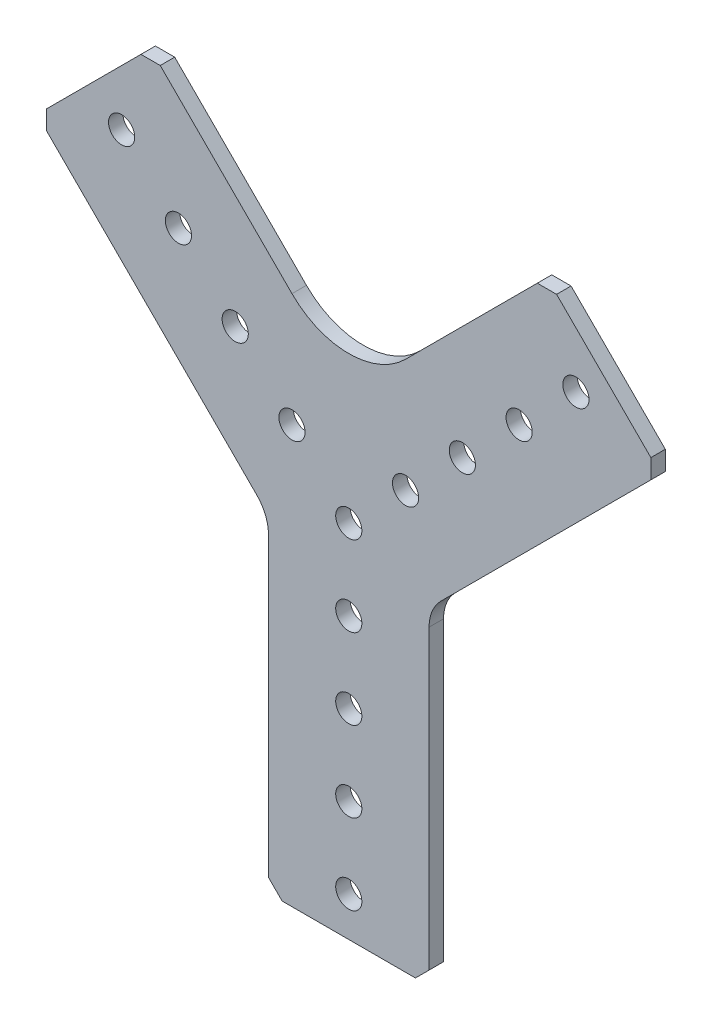
ISO-10303-21;
HEADER;
FILE_DESCRIPTION(('STEP AP214'),'2;1');
FILE_NAME('part.step','',(''),(''),'','','');
FILE_SCHEMA(('AUTOMOTIVE_DESIGN { 1 0 10303 214 1 1 1 1 }'));
ENDSEC;
DATA;
#1=APPLICATION_CONTEXT('core data for automotive mechanical design processes');
#2=APPLICATION_PROTOCOL_DEFINITION('international standard','automotive_design',2000,#1);
#3=PRODUCT_CONTEXT('',#1,'mechanical');
#4=PRODUCT('Part','Part','',(#3));
#5=PRODUCT_RELATED_PRODUCT_CATEGORY('part','',(#4));
#6=PRODUCT_DEFINITION_FORMATION('','',#4);
#7=PRODUCT_DEFINITION_CONTEXT('part definition',#1,'design');
#8=PRODUCT_DEFINITION('design','',#6,#7);
#9=PRODUCT_DEFINITION_SHAPE('','',#8);
#10=(LENGTH_UNIT() NAMED_UNIT(*) SI_UNIT(.MILLI.,.METRE.));
#11=(NAMED_UNIT(*) PLANE_ANGLE_UNIT() SI_UNIT($,.RADIAN.));
#12=(NAMED_UNIT(*) SI_UNIT($,.STERADIAN.) SOLID_ANGLE_UNIT());
#13=UNCERTAINTY_MEASURE_WITH_UNIT(LENGTH_MEASURE(1.E-05),#10,'distance_accuracy_value','');
#14=(GEOMETRIC_REPRESENTATION_CONTEXT(3) GLOBAL_UNCERTAINTY_ASSIGNED_CONTEXT((#13)) GLOBAL_UNIT_ASSIGNED_CONTEXT((#10,
#11,#12)) REPRESENTATION_CONTEXT('',''));
#15=CARTESIAN_POINT('',(0.,0.,0.));
#16=DIRECTION('',(0.,0.,1.));
#17=DIRECTION('',(1.,0.,0.));
#18=AXIS2_PLACEMENT_3D('',#15,#16,#17);
#19=CARTESIAN_POINT('',(31.3410938625313,49.3016061046697,2.286));
#20=DIRECTION('',(0.707106781186548,-0.707106781186547,0.));
#21=DIRECTION('',(0.707106781186547,0.707106781186548,0.));
#22=AXIS2_PLACEMENT_3D('',#19,#20,#21);
#23=PLANE('',#22);
#24=DIRECTION('',(-0.707106781186547,-0.707106781186548,0.));
#25=VECTOR('',#24,1.);
#26=CARTESIAN_POINT('',(29.8144503219496,47.7749625640879,0.));
#27=LINE('',#26,#25);
#28=CARTESIAN_POINT('',(29.8144503219496,47.7749625640879,0.));
#29=VERTEX_POINT('',#28);
#30=CARTESIAN_POINT('',(8.98025612106916,26.9407683632075,0.));
#31=VERTEX_POINT('',#30);
#32=EDGE_CURVE('E338',#29,#31,#27,.T.);
#33=ORIENTED_EDGE('',*,*,#32,.T.);
#34=DIRECTION('',(0.,0.,-1.));
#35=VECTOR('',#34,1.);
#36=CARTESIAN_POINT('',(8.98025612106915,26.9407683632075,2.286));
#37=LINE('',#36,#35);
#38=CARTESIAN_POINT('',(8.98025612106915,26.9407683632075,2.286));
#39=VERTEX_POINT('',#38);
#40=EDGE_CURVE('E82',#31,#39,#37,.F.);
#41=ORIENTED_EDGE('',*,*,#40,.T.);
#42=DIRECTION('',(0.707106781186547,0.707106781186548,0.));
#43=VECTOR('',#42,1.);
#44=CARTESIAN_POINT('',(31.3410938625313,49.3016061046697,2.286));
#45=LINE('',#44,#43);
#46=CARTESIAN_POINT('',(29.8144503219496,47.7749625640879,2.286));
#47=VERTEX_POINT('',#46);
#48=EDGE_CURVE('E380',#47,#39,#45,.F.);
#49=ORIENTED_EDGE('',*,*,#48,.F.);
#50=DIRECTION('',(0.,0.,1.));
#51=VECTOR('',#50,1.);
#52=CARTESIAN_POINT('',(29.8144503219496,47.7749625640879,2.286));
#53=LINE('',#52,#51);
#54=EDGE_CURVE('E383',#29,#47,#53,.T.);
#55=ORIENTED_EDGE('',*,*,#54,.F.);
#56=EDGE_LOOP('',(#33,#41,#49,#55));
#57=FACE_BOUND('',#56,.T.);
#58=ADVANCED_FACE('F54',(#57),#23,.F.);
#59=CARTESIAN_POINT('',(-12.7,-57.023,2.286));
#60=DIRECTION('',(1.,0.,0.));
#61=DIRECTION('',(0.,1.,0.));
#62=AXIS2_PLACEMENT_3D('',#59,#60,#61);
#63=PLANE('',#62);
#64=DIRECTION('',(0.,0.,1.));
#65=VECTOR('',#64,1.);
#66=CARTESIAN_POINT('',(-12.7,-7.89076836320745,2.286));
#67=LINE('',#66,#65);
#68=CARTESIAN_POINT('',(-12.7,-7.89076836320745,0.));
#69=VERTEX_POINT('',#68);
#70=CARTESIAN_POINT('',(-12.7,-7.89076836320746,2.286));
#71=VERTEX_POINT('',#70);
#72=EDGE_CURVE('E279',#69,#71,#67,.T.);
#73=ORIENTED_EDGE('',*,*,#72,.F.);
#74=DIRECTION('',(0.,1.,0.));
#75=VECTOR('',#74,1.);
#76=CARTESIAN_POINT('',(-12.7,0.,0.));
#77=LINE('',#76,#75);
#78=CARTESIAN_POINT('',(-12.7,-54.864,0.));
#79=VERTEX_POINT('',#78);
#80=EDGE_CURVE('E335',#69,#79,#77,.F.);
#81=ORIENTED_EDGE('',*,*,#80,.T.);
#82=DIRECTION('',(0.,0.,1.));
#83=VECTOR('',#82,1.);
#84=CARTESIAN_POINT('',(-12.7,-54.864,2.286));
#85=LINE('',#84,#83);
#86=CARTESIAN_POINT('',(-12.7,-54.864,2.286));
#87=VERTEX_POINT('',#86);
#88=EDGE_CURVE('E373',#79,#87,#85,.T.);
#89=ORIENTED_EDGE('',*,*,#88,.T.);
#90=DIRECTION('',(0.,1.,0.));
#91=VECTOR('',#90,1.);
#92=CARTESIAN_POINT('',(-12.7,-57.023,2.286));
#93=LINE('',#92,#91);
#94=EDGE_CURVE('E377',#71,#87,#93,.F.);
#95=ORIENTED_EDGE('',*,*,#94,.F.);
#96=EDGE_LOOP('',(#73,#81,#89,#95));
#97=FACE_BOUND('',#96,.T.);
#98=ADVANCED_FACE('F584',(#97),#63,.F.);
#99=CARTESIAN_POINT('',(8.98025612106925,8.98025612106906,2.286));
#100=DIRECTION('',(0.,0.,-1.));
#101=DIRECTION('',(-1.,0.,0.));
#102=AXIS2_PLACEMENT_3D('',#99,#100,#101);
#103=CYLINDRICAL_SURFACE('',#102,2.0701);
#104=CARTESIAN_POINT('',(8.98025612106925,8.98025612106906,2.286));
#105=DIRECTION('',(0.,0.,-1.));
#106=DIRECTION('',(-1.,0.,0.));
#107=AXIS2_PLACEMENT_3D('',#104,#105,#106);
#108=CIRCLE('',#107,2.0701);
#109=CARTESIAN_POINT('',(6.91015612106925,8.98025612106906,2.286));
#110=VERTEX_POINT('',#109);
#111=EDGE_CURVE('E516',#110,#110,#108,.T.);
#112=ORIENTED_EDGE('',*,*,#111,.F.);
#113=EDGE_LOOP('',(#112));
#114=FACE_BOUND('',#113,.T.);
#115=CARTESIAN_POINT('',(8.98025612106925,8.98025612106906,0.));
#116=DIRECTION('',(0.,0.,-1.));
#117=DIRECTION('',(-1.,0.,0.));
#118=AXIS2_PLACEMENT_3D('',#115,#116,#117);
#119=CIRCLE('',#118,2.0701);
#120=CARTESIAN_POINT('',(6.91015612106925,8.98025612106906,0.));
#121=VERTEX_POINT('',#120);
#122=EDGE_CURVE('E479',#121,#121,#119,.T.);
#123=ORIENTED_EDGE('',*,*,#122,.T.);
#124=EDGE_LOOP('',(#123));
#125=FACE_BOUND('',#124,.T.);
#126=ADVANCED_FACE('F589',(#114,#125),#103,.F.);
#127=CARTESIAN_POINT('',(0.,0.,2.286));
#128=DIRECTION('',(0.,0.,1.));
#129=DIRECTION('',(1.,0.,0.));
#130=AXIS2_PLACEMENT_3D('',#127,#128,#129);
#131=PLANE('',#130);
#132=ORIENTED_EDGE('',*,*,#111,.T.);
#133=EDGE_LOOP('',(#132));
#134=FACE_BOUND('',#133,.T.);
#135=CARTESIAN_POINT('',(-8.98025612106925,8.98025612106906,2.286));
#136=DIRECTION('',(0.,0.,1.));
#137=DIRECTION('',(1.,0.,0.));
#138=AXIS2_PLACEMENT_3D('',#135,#136,#137);
#139=CIRCLE('',#138,2.0701);
#140=CARTESIAN_POINT('',(-6.91015612106925,8.98025612106906,2.286));
#141=VERTEX_POINT('',#140);
#142=EDGE_CURVE('E320',#141,#141,#139,.T.);
#143=ORIENTED_EDGE('',*,*,#142,.F.);
#144=EDGE_LOOP('',(#143));
#145=FACE_BOUND('',#144,.T.);
#146=ORIENTED_EDGE('',*,*,#48,.T.);
#147=CARTESIAN_POINT('',(0.,35.9210244842766,2.286));
#148=DIRECTION('',(0.,0.,1.));
#149=DIRECTION('',(1.,0.,0.));
#150=AXIS2_PLACEMENT_3D('',#147,#148,#149);
#151=CIRCLE('',#150,12.7);
#152=CARTESIAN_POINT('',(-8.98025612106915,26.9407683632075,2.286));
#153=VERTEX_POINT('',#152);
#154=EDGE_CURVE('E13',#39,#153,#151,.F.);
#155=ORIENTED_EDGE('',*,*,#154,.T.);
#156=DIRECTION('',(-0.707106781186547,0.707106781186548,0.));
#157=VECTOR('',#156,1.);
#158=CARTESIAN_POINT('',(-31.3410938625313,49.3016061046697,2.286));
#159=LINE('',#158,#157);
#160=CARTESIAN_POINT('',(-29.8144503219496,47.7749625640879,2.286));
#161=VERTEX_POINT('',#160);
#162=EDGE_CURVE('E242',#161,#153,#159,.F.);
#163=ORIENTED_EDGE('',*,*,#162,.F.);
#164=DIRECTION('',(-1.,0.,0.));
#165=VECTOR('',#164,1.);
#166=CARTESIAN_POINT('',(-29.8144503219496,47.7749625640879,2.286));
#167=LINE('',#166,#165);
#168=CARTESIAN_POINT('',(-32.8677374031131,47.7749625640879,2.286));
#169=VERTEX_POINT('',#168);
#170=EDGE_CURVE('E240',#169,#161,#167,.F.);
#171=ORIENTED_EDGE('',*,*,#170,.F.);
#172=DIRECTION('',(-0.707106781186548,-0.707106781186547,0.));
#173=VECTOR('',#172,1.);
#174=CARTESIAN_POINT('',(-49.3016061046696,31.3410938625314,2.286));
#175=LINE('',#174,#173);
#176=CARTESIAN_POINT('',(-47.7749625640879,32.8677374031131,2.286));
#177=VERTEX_POINT('',#176);
#178=EDGE_CURVE('E256',#177,#169,#175,.F.);
#179=ORIENTED_EDGE('',*,*,#178,.F.);
#180=DIRECTION('',(0.,-1.,0.));
#181=VECTOR('',#180,1.);
#182=CARTESIAN_POINT('',(-47.7749625640879,32.8677374031131,2.286));
#183=LINE('',#182,#181);
#184=CARTESIAN_POINT('',(-47.7749625640879,29.8144503219496,2.286));
#185=VERTEX_POINT('',#184);
#186=EDGE_CURVE('E263',#185,#177,#183,.F.);
#187=ORIENTED_EDGE('',*,*,#186,.F.);
#188=DIRECTION('',(0.707106781186547,-0.707106781186548,0.));
#189=VECTOR('',#188,1.);
#190=CARTESIAN_POINT('',(-12.7,-5.26051224213831,2.286));
#191=LINE('',#190,#189);
#192=CARTESIAN_POINT('',(-14.5598719394654,-3.40064030267288,2.286));
#193=VERTEX_POINT('',#192);
#194=EDGE_CURVE('E266',#193,#185,#191,.F.);
#195=ORIENTED_EDGE('',*,*,#194,.F.);
#196=CARTESIAN_POINT('',(-19.05,-7.89076836320745,2.286));
#197=DIRECTION('',(0.,0.,-1.));
#198=DIRECTION('',(-1.,0.,0.));
#199=AXIS2_PLACEMENT_3D('',#196,#197,#198);
#200=CIRCLE('',#199,6.35);
#201=EDGE_CURVE('E267',#71,#193,#200,.F.);
#202=ORIENTED_EDGE('',*,*,#201,.F.);
#203=ORIENTED_EDGE('',*,*,#94,.T.);
#204=DIRECTION('',(-0.707106781186548,0.707106781186548,0.));
#205=VECTOR('',#204,1.);
#206=CARTESIAN_POINT('',(-10.541,-57.023,2.286));
#207=LINE('',#206,#205);
#208=CARTESIAN_POINT('',(-10.541,-57.023,2.286));
#209=VERTEX_POINT('',#208);
#210=EDGE_CURVE('E370',#87,#209,#207,.F.);
#211=ORIENTED_EDGE('',*,*,#210,.T.);
#212=DIRECTION('',(1.,0.,0.));
#213=VECTOR('',#212,1.);
#214=CARTESIAN_POINT('',(12.7,-57.023,2.286));
#215=LINE('',#214,#213);
#216=CARTESIAN_POINT('',(10.541,-57.023,2.286));
#217=VERTEX_POINT('',#216);
#218=EDGE_CURVE('E368',#209,#217,#215,.T.);
#219=ORIENTED_EDGE('',*,*,#218,.T.);
#220=DIRECTION('',(-0.707106781186547,-0.707106781186548,0.));
#221=VECTOR('',#220,1.);
#222=CARTESIAN_POINT('',(12.7,-54.864,2.286));
#223=LINE('',#222,#221);
#224=CARTESIAN_POINT('',(12.7,-54.864,2.286));
#225=VERTEX_POINT('',#224);
#226=EDGE_CURVE('E428',#217,#225,#223,.F.);
#227=ORIENTED_EDGE('',*,*,#226,.T.);
#228=DIRECTION('',(0.,-1.,0.));
#229=VECTOR('',#228,1.);
#230=CARTESIAN_POINT('',(12.7,-5.2605122421383,2.286));
#231=LINE('',#230,#229);
#232=CARTESIAN_POINT('',(12.7,-7.89076836320745,2.286));
#233=VERTEX_POINT('',#232);
#234=EDGE_CURVE('E423',#225,#233,#231,.F.);
#235=ORIENTED_EDGE('',*,*,#234,.T.);
#236=CARTESIAN_POINT('',(19.05,-7.89076836320745,2.286));
#237=DIRECTION('',(0.,0.,1.));
#238=DIRECTION('',(1.,0.,0.));
#239=AXIS2_PLACEMENT_3D('',#236,#237,#238);
#240=CIRCLE('',#239,6.35);
#241=CARTESIAN_POINT('',(14.5598719394654,-3.40064030267288,2.286));
#242=VERTEX_POINT('',#241);
#243=EDGE_CURVE('E407',#233,#242,#240,.F.);
#244=ORIENTED_EDGE('',*,*,#243,.T.);
#245=DIRECTION('',(-0.707106781186547,-0.707106781186548,0.));
#246=VECTOR('',#245,1.);
#247=CARTESIAN_POINT('',(12.7,-5.26051224213831,2.286));
#248=LINE('',#247,#246);
#249=CARTESIAN_POINT('',(47.7749625640879,29.8144503219496,2.286));
#250=VERTEX_POINT('',#249);
#251=EDGE_CURVE('E406',#242,#250,#248,.F.);
#252=ORIENTED_EDGE('',*,*,#251,.T.);
#253=DIRECTION('',(0.,-1.,0.));
#254=VECTOR('',#253,1.);
#255=CARTESIAN_POINT('',(47.7749625640879,32.8677374031131,2.286));
#256=LINE('',#255,#254);
#257=CARTESIAN_POINT('',(47.7749625640879,32.8677374031131,2.286));
#258=VERTEX_POINT('',#257);
#259=EDGE_CURVE('E401',#250,#258,#256,.F.);
#260=ORIENTED_EDGE('',*,*,#259,.T.);
#261=DIRECTION('',(0.707106781186548,-0.707106781186547,0.));
#262=VECTOR('',#261,1.);
#263=CARTESIAN_POINT('',(49.3016061046696,31.3410938625314,2.286));
#264=LINE('',#263,#262);
#265=CARTESIAN_POINT('',(32.8677374031131,47.7749625640879,2.286));
#266=VERTEX_POINT('',#265);
#267=EDGE_CURVE('E394',#258,#266,#264,.F.);
#268=ORIENTED_EDGE('',*,*,#267,.T.);
#269=DIRECTION('',(1.,0.,0.));
#270=VECTOR('',#269,1.);
#271=CARTESIAN_POINT('',(29.8144503219496,47.7749625640879,2.286));
#272=LINE('',#271,#270);
#273=EDGE_CURVE('E387',#266,#47,#272,.F.);
#274=ORIENTED_EDGE('',*,*,#273,.T.);
#275=EDGE_LOOP('',(#146,#155,#163,#171,#179,#187,#195,#202,#203,#211,#219,#227,#235,#244,#252,
#260,#268,#274));
#276=FACE_BOUND('',#275,.T.);
#277=CARTESIAN_POINT('',(0.,-50.8,2.286));
#278=DIRECTION('',(0.,0.,-1.));
#279=DIRECTION('',(-1.,0.,0.));
#280=AXIS2_PLACEMENT_3D('',#277,#278,#279);
#281=CIRCLE('',#280,2.0701);
#282=CARTESIAN_POINT('',(-2.07009999999999,-50.8,2.286));
#283=VERTEX_POINT('',#282);
#284=EDGE_CURVE('E524',#283,#283,#281,.T.);
#285=ORIENTED_EDGE('',*,*,#284,.T.);
#286=EDGE_LOOP('',(#285));
#287=FACE_BOUND('',#286,.T.);
#288=CARTESIAN_POINT('',(2.66050878019847E-13,-25.4,2.286));
#289=DIRECTION('',(0.,0.,-1.));
#290=DIRECTION('',(-1.,0.,0.));
#291=AXIS2_PLACEMENT_3D('',#288,#289,#290);
#292=CIRCLE('',#291,2.0701);
#293=CARTESIAN_POINT('',(-2.07009999999973,-25.4,2.286));
#294=VERTEX_POINT('',#293);
#295=EDGE_CURVE('E456',#294,#294,#292,.T.);
#296=ORIENTED_EDGE('',*,*,#295,.T.);
#297=EDGE_LOOP('',(#296));
#298=FACE_BOUND('',#297,.T.);
#299=CARTESIAN_POINT('',(1.33025439009923E-13,-12.7,2.286));
#300=DIRECTION('',(0.,0.,-1.));
#301=DIRECTION('',(-1.,0.,0.));
#302=AXIS2_PLACEMENT_3D('',#299,#300,#301);
#303=CIRCLE('',#302,2.0701);
#304=CARTESIAN_POINT('',(-2.07009999999987,-12.7,2.286));
#305=VERTEX_POINT('',#304);
#306=EDGE_CURVE('E450',#305,#305,#303,.T.);
#307=ORIENTED_EDGE('',*,*,#306,.T.);
#308=EDGE_LOOP('',(#307));
#309=FACE_BOUND('',#308,.T.);
#310=CARTESIAN_POINT('',(3.9907631702977E-13,-38.1,2.286));
#311=DIRECTION('',(0.,0.,-1.));
#312=DIRECTION('',(-1.,0.,0.));
#313=AXIS2_PLACEMENT_3D('',#310,#311,#312);
#314=CIRCLE('',#313,2.0701);
#315=CARTESIAN_POINT('',(-2.0700999999996,-38.1,2.286));
#316=VERTEX_POINT('',#315);
#317=EDGE_CURVE('E536',#316,#316,#314,.T.);
#318=ORIENTED_EDGE('',*,*,#317,.T.);
#319=EDGE_LOOP('',(#318));
#320=FACE_BOUND('',#319,.T.);
#321=CARTESIAN_POINT('',(0.,0.,2.286));
#322=DIRECTION('',(0.,0.,-1.));
#323=DIRECTION('',(-1.,0.,0.));
#324=AXIS2_PLACEMENT_3D('',#321,#322,#323);
#325=CIRCLE('',#324,2.0701);
#326=CARTESIAN_POINT('',(-2.0701,0.,2.286));
#327=VERTEX_POINT('',#326);
#328=EDGE_CURVE('E297',#327,#327,#325,.T.);
#329=ORIENTED_EDGE('',*,*,#328,.T.);
#330=EDGE_LOOP('',(#329));
#331=FACE_BOUND('',#330,.T.);
#332=CARTESIAN_POINT('',(-26.9407683632077,26.9407683632072,2.286));
#333=DIRECTION('',(0.,0.,1.));
#334=DIRECTION('',(1.,0.,0.));
#335=AXIS2_PLACEMENT_3D('',#332,#333,#334);
#336=CIRCLE('',#335,2.0701);
#337=CARTESIAN_POINT('',(-24.8706683632077,26.9407683632072,2.286));
#338=VERTEX_POINT('',#337);
#339=EDGE_CURVE('E247',#338,#338,#336,.T.);
#340=ORIENTED_EDGE('',*,*,#339,.F.);
#341=EDGE_LOOP('',(#340));
#342=FACE_BOUND('',#341,.T.);
#343=CARTESIAN_POINT('',(-17.9605122421385,17.9605122421381,2.286));
#344=DIRECTION('',(0.,0.,1.));
#345=DIRECTION('',(1.,0.,0.));
#346=AXIS2_PLACEMENT_3D('',#343,#344,#345);
#347=CIRCLE('',#346,2.0701);
#348=CARTESIAN_POINT('',(-15.8904122421385,17.9605122421381,2.286));
#349=VERTEX_POINT('',#348);
#350=EDGE_CURVE('E316',#349,#349,#347,.T.);
#351=ORIENTED_EDGE('',*,*,#350,.F.);
#352=EDGE_LOOP('',(#351));
#353=FACE_BOUND('',#352,.T.);
#354=CARTESIAN_POINT('',(-35.9210244842766,35.9210244842766,2.286));
#355=DIRECTION('',(0.,0.,1.));
#356=DIRECTION('',(1.,0.,0.));
#357=AXIS2_PLACEMENT_3D('',#354,#355,#356);
#358=CIRCLE('',#357,2.0701);
#359=CARTESIAN_POINT('',(-33.8509244842766,35.9210244842766,2.286));
#360=VERTEX_POINT('',#359);
#361=EDGE_CURVE('E312',#360,#360,#358,.T.);
#362=ORIENTED_EDGE('',*,*,#361,.F.);
#363=EDGE_LOOP('',(#362));
#364=FACE_BOUND('',#363,.T.);
#365=CARTESIAN_POINT('',(26.9407683632077,26.9407683632072,2.286));
#366=DIRECTION('',(0.,0.,-1.));
#367=DIRECTION('',(-1.,0.,0.));
#368=AXIS2_PLACEMENT_3D('',#365,#366,#367);
#369=CIRCLE('',#368,2.0701);
#370=CARTESIAN_POINT('',(24.8706683632077,26.9407683632072,2.286));
#371=VERTEX_POINT('',#370);
#372=EDGE_CURVE('E520',#371,#371,#369,.T.);
#373=ORIENTED_EDGE('',*,*,#372,.T.);
#374=EDGE_LOOP('',(#373));
#375=FACE_BOUND('',#374,.T.);
#376=CARTESIAN_POINT('',(17.9605122421385,17.9605122421381,2.286));
#377=DIRECTION('',(0.,0.,-1.));
#378=DIRECTION('',(-1.,0.,0.));
#379=AXIS2_PLACEMENT_3D('',#376,#377,#378);
#380=CIRCLE('',#379,2.0701);
#381=CARTESIAN_POINT('',(15.8904122421385,17.9605122421381,2.286));
#382=VERTEX_POINT('',#381);
#383=EDGE_CURVE('E512',#382,#382,#380,.T.);
#384=ORIENTED_EDGE('',*,*,#383,.T.);
#385=EDGE_LOOP('',(#384));
#386=FACE_BOUND('',#385,.T.);
#387=CARTESIAN_POINT('',(35.9210244842766,35.9210244842766,2.286));
#388=DIRECTION('',(0.,0.,-1.));
#389=DIRECTION('',(-1.,0.,0.));
#390=AXIS2_PLACEMENT_3D('',#387,#388,#389);
#391=CIRCLE('',#390,2.0701);
#392=CARTESIAN_POINT('',(33.8509244842766,35.9210244842766,2.286));
#393=VERTEX_POINT('',#392);
#394=EDGE_CURVE('E508',#393,#393,#391,.T.);
#395=ORIENTED_EDGE('',*,*,#394,.T.);
#396=EDGE_LOOP('',(#395));
#397=FACE_BOUND('',#396,.T.);
#398=ADVANCED_FACE('F571',(#134,#145,#276,#287,#298,#309,#320,#331,#342,#353,#364,#375,#386,
#397),#131,.T.);
#399=CARTESIAN_POINT('',(0.,0.,2.286));
#400=DIRECTION('',(0.,0.,-1.));
#401=DIRECTION('',(-1.,0.,0.));
#402=AXIS2_PLACEMENT_3D('',#399,#400,#401);
#403=CYLINDRICAL_SURFACE('',#402,2.0701);
#404=ORIENTED_EDGE('',*,*,#328,.F.);
#405=EDGE_LOOP('',(#404));
#406=FACE_BOUND('',#405,.T.);
#407=CARTESIAN_POINT('',(0.,0.,0.));
#408=DIRECTION('',(0.,0.,-1.));
#409=DIRECTION('',(-1.,0.,0.));
#410=AXIS2_PLACEMENT_3D('',#407,#408,#409);
#411=CIRCLE('',#410,2.0701);
#412=CARTESIAN_POINT('',(-2.0701,0.,0.));
#413=VERTEX_POINT('',#412);
#414=EDGE_CURVE('E504',#413,#413,#411,.T.);
#415=ORIENTED_EDGE('',*,*,#414,.T.);
#416=EDGE_LOOP('',(#415));
#417=FACE_BOUND('',#416,.T.);
#418=ADVANCED_FACE('F630',(#406,#417),#403,.F.);
#419=CARTESIAN_POINT('',(3.9907631702977E-13,-38.1,2.286));
#420=DIRECTION('',(0.,0.,-1.));
#421=DIRECTION('',(-1.,0.,0.));
#422=AXIS2_PLACEMENT_3D('',#419,#420,#421);
#423=CYLINDRICAL_SURFACE('',#422,2.0701);
#424=CARTESIAN_POINT('',(3.9907631702977E-13,-38.1,0.));
#425=DIRECTION('',(0.,0.,-1.));
#426=DIRECTION('',(-1.,0.,0.));
#427=AXIS2_PLACEMENT_3D('',#424,#425,#426);
#428=CIRCLE('',#427,2.0701);
#429=CARTESIAN_POINT('',(-2.0700999999996,-38.1,0.));
#430=VERTEX_POINT('',#429);
#431=EDGE_CURVE('E500',#430,#430,#428,.T.);
#432=ORIENTED_EDGE('',*,*,#431,.T.);
#433=EDGE_LOOP('',(#432));
#434=FACE_BOUND('',#433,.T.);
#435=ORIENTED_EDGE('',*,*,#317,.F.);
#436=EDGE_LOOP('',(#435));
#437=FACE_BOUND('',#436,.T.);
#438=ADVANCED_FACE('F626',(#434,#437),#423,.F.);
#439=CARTESIAN_POINT('',(1.33025439009923E-13,-12.7,2.286));
#440=DIRECTION('',(0.,0.,-1.));
#441=DIRECTION('',(-1.,0.,0.));
#442=AXIS2_PLACEMENT_3D('',#439,#440,#441);
#443=CYLINDRICAL_SURFACE('',#442,2.0701);
#444=CARTESIAN_POINT('',(1.33025439009923E-13,-12.7,0.));
#445=DIRECTION('',(0.,0.,-1.));
#446=DIRECTION('',(-1.,0.,0.));
#447=AXIS2_PLACEMENT_3D('',#444,#445,#446);
#448=CIRCLE('',#447,2.0701);
#449=CARTESIAN_POINT('',(-2.07009999999987,-12.7,0.));
#450=VERTEX_POINT('',#449);
#451=EDGE_CURVE('E434',#450,#450,#448,.T.);
#452=ORIENTED_EDGE('',*,*,#451,.T.);
#453=EDGE_LOOP('',(#452));
#454=FACE_BOUND('',#453,.T.);
#455=ORIENTED_EDGE('',*,*,#306,.F.);
#456=EDGE_LOOP('',(#455));
#457=FACE_BOUND('',#456,.T.);
#458=ADVANCED_FACE('F622',(#454,#457),#443,.F.);
#459=CARTESIAN_POINT('',(12.7,-54.864,2.286));
#460=DIRECTION('',(-0.707106781186548,0.707106781186547,0.));
#461=DIRECTION('',(-0.707106781186547,-0.707106781186548,0.));
#462=AXIS2_PLACEMENT_3D('',#459,#460,#461);
#463=PLANE('',#462);
#464=DIRECTION('',(0.,0.,1.));
#465=VECTOR('',#464,1.);
#466=CARTESIAN_POINT('',(10.541,-57.023,2.286));
#467=LINE('',#466,#465);
#468=CARTESIAN_POINT('',(10.541,-57.023,0.));
#469=VERTEX_POINT('',#468);
#470=EDGE_CURVE('E369',#217,#469,#467,.F.);
#471=ORIENTED_EDGE('',*,*,#470,.T.);
#472=DIRECTION('',(0.707106781186548,0.707106781186547,0.));
#473=VECTOR('',#472,1.);
#474=CARTESIAN_POINT('',(10.541,-57.023,0.));
#475=LINE('',#474,#473);
#476=CARTESIAN_POINT('',(12.7,-54.864,0.));
#477=VERTEX_POINT('',#476);
#478=EDGE_CURVE('E361',#469,#477,#475,.T.);
#479=ORIENTED_EDGE('',*,*,#478,.T.);
#480=DIRECTION('',(0.,0.,1.));
#481=VECTOR('',#480,1.);
#482=CARTESIAN_POINT('',(12.7,-54.864,2.286));
#483=LINE('',#482,#481);
#484=EDGE_CURVE('E424',#477,#225,#483,.T.);
#485=ORIENTED_EDGE('',*,*,#484,.T.);
#486=ORIENTED_EDGE('',*,*,#226,.F.);
#487=EDGE_LOOP('',(#471,#479,#485,#486));
#488=FACE_BOUND('',#487,.T.);
#489=ADVANCED_FACE('F618',(#488),#463,.F.);
#490=CARTESIAN_POINT('',(12.7,-5.2605122421383,2.286));
#491=DIRECTION('',(-1.,0.,0.));
#492=DIRECTION('',(0.,-1.,0.));
#493=AXIS2_PLACEMENT_3D('',#490,#491,#492);
#494=PLANE('',#493);
#495=DIRECTION('',(0.,0.,1.));
#496=VECTOR('',#495,1.);
#497=CARTESIAN_POINT('',(12.7,-7.89076836320745,2.286));
#498=LINE('',#497,#496);
#499=CARTESIAN_POINT('',(12.7,-7.89076836320745,0.));
#500=VERTEX_POINT('',#499);
#501=EDGE_CURVE('E419',#500,#233,#498,.T.);
#502=ORIENTED_EDGE('',*,*,#501,.T.);
#503=ORIENTED_EDGE('',*,*,#234,.F.);
#504=ORIENTED_EDGE('',*,*,#484,.F.);
#505=DIRECTION('',(0.,1.,0.));
#506=VECTOR('',#505,1.);
#507=CARTESIAN_POINT('',(12.7,0.,0.));
#508=LINE('',#507,#506);
#509=EDGE_CURVE('E357',#477,#500,#508,.T.);
#510=ORIENTED_EDGE('',*,*,#509,.T.);
#511=EDGE_LOOP('',(#502,#503,#504,#510));
#512=FACE_BOUND('',#511,.T.);
#513=ADVANCED_FACE('F614',(#512),#494,.F.);
#514=CARTESIAN_POINT('',(19.05,-7.89076836320745,2.286));
#515=DIRECTION('',(0.,0.,1.));
#516=DIRECTION('',(1.,0.,0.));
#517=AXIS2_PLACEMENT_3D('',#514,#515,#516);
#518=CYLINDRICAL_SURFACE('',#517,6.35);
#519=ORIENTED_EDGE('',*,*,#501,.F.);
#520=CARTESIAN_POINT('',(19.05,-7.89076836320745,0.));
#521=DIRECTION('',(0.,0.,1.));
#522=DIRECTION('',(1.,0.,0.));
#523=AXIS2_PLACEMENT_3D('',#520,#521,#522);
#524=CIRCLE('',#523,6.35);
#525=CARTESIAN_POINT('',(14.5598719394654,-3.40064030267288,0.));
#526=VERTEX_POINT('',#525);
#527=EDGE_CURVE('E354',#500,#526,#524,.F.);
#528=ORIENTED_EDGE('',*,*,#527,.T.);
#529=DIRECTION('',(0.,0.,1.));
#530=VECTOR('',#529,1.);
#531=CARTESIAN_POINT('',(14.5598719394654,-3.40064030267288,2.286));
#532=LINE('',#531,#530);
#533=EDGE_CURVE('E402',#526,#242,#532,.T.);
#534=ORIENTED_EDGE('',*,*,#533,.T.);
#535=ORIENTED_EDGE('',*,*,#243,.F.);
#536=EDGE_LOOP('',(#519,#528,#534,#535));
#537=FACE_BOUND('',#536,.T.);
#538=ADVANCED_FACE('F610',(#537),#518,.F.);
#539=CARTESIAN_POINT('',(12.7,-5.26051224213831,2.286));
#540=DIRECTION('',(-0.707106781186548,0.707106781186547,0.));
#541=DIRECTION('',(-0.707106781186547,-0.707106781186548,0.));
#542=AXIS2_PLACEMENT_3D('',#539,#540,#541);
#543=PLANE('',#542);
#544=ORIENTED_EDGE('',*,*,#533,.F.);
#545=DIRECTION('',(0.707106781186547,0.707106781186548,0.));
#546=VECTOR('',#545,1.);
#547=CARTESIAN_POINT('',(14.5598719394654,-3.40064030267288,0.));
#548=LINE('',#547,#546);
#549=CARTESIAN_POINT('',(47.7749625640879,29.8144503219496,0.));
#550=VERTEX_POINT('',#549);
#551=EDGE_CURVE('E350',#526,#550,#548,.T.);
#552=ORIENTED_EDGE('',*,*,#551,.T.);
#553=DIRECTION('',(0.,0.,1.));
#554=VECTOR('',#553,1.);
#555=CARTESIAN_POINT('',(47.7749625640879,29.8144503219496,2.286));
#556=LINE('',#555,#554);
#557=EDGE_CURVE('E413',#550,#250,#556,.T.);
#558=ORIENTED_EDGE('',*,*,#557,.T.);
#559=ORIENTED_EDGE('',*,*,#251,.F.);
#560=EDGE_LOOP('',(#544,#552,#558,#559));
#561=FACE_BOUND('',#560,.T.);
#562=ADVANCED_FACE('F606',(#561),#543,.F.);
#563=CARTESIAN_POINT('',(47.7749625640879,32.8677374031131,2.286));
#564=DIRECTION('',(-1.,0.,0.));
#565=DIRECTION('',(0.,-1.,0.));
#566=AXIS2_PLACEMENT_3D('',#563,#564,#565);
#567=PLANE('',#566);
#568=ORIENTED_EDGE('',*,*,#557,.F.);
#569=DIRECTION('',(0.,1.,0.));
#570=VECTOR('',#569,1.);
#571=CARTESIAN_POINT('',(47.7749625640879,0.,0.));
#572=LINE('',#571,#570);
#573=CARTESIAN_POINT('',(47.7749625640879,32.8677374031131,0.));
#574=VERTEX_POINT('',#573);
#575=EDGE_CURVE('E349',#550,#574,#572,.T.);
#576=ORIENTED_EDGE('',*,*,#575,.T.);
#577=DIRECTION('',(0.,0.,1.));
#578=VECTOR('',#577,1.);
#579=CARTESIAN_POINT('',(47.7749625640879,32.8677374031131,2.286));
#580=LINE('',#579,#578);
#581=EDGE_CURVE('E397',#574,#258,#580,.T.);
#582=ORIENTED_EDGE('',*,*,#581,.T.);
#583=ORIENTED_EDGE('',*,*,#259,.F.);
#584=EDGE_LOOP('',(#568,#576,#582,#583));
#585=FACE_BOUND('',#584,.T.);
#586=ADVANCED_FACE('F602',(#585),#567,.F.);
#587=CARTESIAN_POINT('',(49.3016061046696,31.3410938625314,2.286));
#588=DIRECTION('',(-0.707106781186547,-0.707106781186548,0.));
#589=DIRECTION('',(0.707106781186548,-0.707106781186547,0.));
#590=AXIS2_PLACEMENT_3D('',#587,#588,#589);
#591=PLANE('',#590);
#592=DIRECTION('',(0.,0.,-1.));
#593=VECTOR('',#592,1.);
#594=CARTESIAN_POINT('',(32.8677374031131,47.7749625640879,2.286));
#595=LINE('',#594,#593);
#596=CARTESIAN_POINT('',(32.8677374031131,47.7749625640879,0.));
#597=VERTEX_POINT('',#596);
#598=EDGE_CURVE('E390',#597,#266,#595,.F.);
#599=ORIENTED_EDGE('',*,*,#598,.T.);
#600=ORIENTED_EDGE('',*,*,#267,.F.);
#601=ORIENTED_EDGE('',*,*,#581,.F.);
#602=DIRECTION('',(-0.707106781186547,0.707106781186547,0.));
#603=VECTOR('',#602,1.);
#604=CARTESIAN_POINT('',(47.7749625640879,32.8677374031131,0.));
#605=LINE('',#604,#603);
#606=EDGE_CURVE('E345',#574,#597,#605,.T.);
#607=ORIENTED_EDGE('',*,*,#606,.T.);
#608=EDGE_LOOP('',(#599,#600,#601,#607));
#609=FACE_BOUND('',#608,.T.);
#610=ADVANCED_FACE('F598',(#609),#591,.F.);
#611=CARTESIAN_POINT('',(29.8144503219496,47.7749625640879,2.286));
#612=DIRECTION('',(0.,-1.,0.));
#613=DIRECTION('',(0.,0.,-1.));
#614=AXIS2_PLACEMENT_3D('',#611,#612,#613);
#615=PLANE('',#614);
#616=ORIENTED_EDGE('',*,*,#598,.F.);
#617=DIRECTION('',(1.,0.,0.));
#618=VECTOR('',#617,1.);
#619=CARTESIAN_POINT('',(0.,47.7749625640879,0.));
#620=LINE('',#619,#618);
#621=EDGE_CURVE('E341',#597,#29,#620,.F.);
#622=ORIENTED_EDGE('',*,*,#621,.T.);
#623=ORIENTED_EDGE('',*,*,#54,.T.);
#624=ORIENTED_EDGE('',*,*,#273,.F.);
#625=EDGE_LOOP('',(#616,#622,#623,#624));
#626=FACE_BOUND('',#625,.T.);
#627=ADVANCED_FACE('F594',(#626),#615,.F.);
#628=CARTESIAN_POINT('',(-10.541,-57.023,2.286));
#629=DIRECTION('',(0.707106781186548,0.707106781186548,0.));
#630=DIRECTION('',(-0.707106781186548,0.707106781186548,0.));
#631=AXIS2_PLACEMENT_3D('',#628,#629,#630);
#632=PLANE('',#631);
#633=ORIENTED_EDGE('',*,*,#88,.F.);
#634=DIRECTION('',(0.707106781186547,-0.707106781186548,0.));
#635=VECTOR('',#634,1.);
#636=CARTESIAN_POINT('',(-12.7,-54.864,0.));
#637=LINE('',#636,#635);
#638=CARTESIAN_POINT('',(-10.541,-57.023,0.));
#639=VERTEX_POINT('',#638);
#640=EDGE_CURVE('E330',#79,#639,#637,.T.);
#641=ORIENTED_EDGE('',*,*,#640,.T.);
#642=DIRECTION('',(0.,0.,1.));
#643=VECTOR('',#642,1.);
#644=CARTESIAN_POINT('',(-10.541,-57.023,2.286));
#645=LINE('',#644,#643);
#646=EDGE_CURVE('E364',#639,#209,#645,.T.);
#647=ORIENTED_EDGE('',*,*,#646,.T.);
#648=ORIENTED_EDGE('',*,*,#210,.F.);
#649=EDGE_LOOP('',(#633,#641,#647,#648));
#650=FACE_BOUND('',#649,.T.);
#651=ADVANCED_FACE('F597',(#650),#632,.F.);
#652=CARTESIAN_POINT('',(12.7,-57.023,2.286));
#653=DIRECTION('',(0.,1.,0.));
#654=DIRECTION('',(0.,0.,1.));
#655=AXIS2_PLACEMENT_3D('',#652,#653,#654);
#656=PLANE('',#655);
#657=ORIENTED_EDGE('',*,*,#646,.F.);
#658=DIRECTION('',(1.,0.,0.));
#659=VECTOR('',#658,1.);
#660=CARTESIAN_POINT('',(0.,-57.023,0.));
#661=LINE('',#660,#659);
#662=EDGE_CURVE('E334',#639,#469,#661,.T.);
#663=ORIENTED_EDGE('',*,*,#662,.T.);
#664=ORIENTED_EDGE('',*,*,#470,.F.);
#665=ORIENTED_EDGE('',*,*,#218,.F.);
#666=EDGE_LOOP('',(#657,#663,#664,#665));
#667=FACE_BOUND('',#666,.T.);
#668=ADVANCED_FACE('F687',(#667),#656,.F.);
#669=CARTESIAN_POINT('',(2.66050878019847E-13,-25.4,2.286));
#670=DIRECTION('',(0.,0.,-1.));
#671=DIRECTION('',(-1.,0.,0.));
#672=AXIS2_PLACEMENT_3D('',#669,#670,#671);
#673=CYLINDRICAL_SURFACE('',#672,2.0701);
#674=CARTESIAN_POINT('',(2.66050878019847E-13,-25.4,0.));
#675=DIRECTION('',(0.,0.,-1.));
#676=DIRECTION('',(-1.,0.,0.));
#677=AXIS2_PLACEMENT_3D('',#674,#675,#676);
#678=CIRCLE('',#677,2.0701);
#679=CARTESIAN_POINT('',(-2.07009999999973,-25.4,0.));
#680=VERTEX_POINT('',#679);
#681=EDGE_CURVE('E445',#680,#680,#678,.T.);
#682=ORIENTED_EDGE('',*,*,#681,.T.);
#683=EDGE_LOOP('',(#682));
#684=FACE_BOUND('',#683,.T.);
#685=ORIENTED_EDGE('',*,*,#295,.F.);
#686=EDGE_LOOP('',(#685));
#687=FACE_BOUND('',#686,.T.);
#688=ADVANCED_FACE('F683',(#684,#687),#673,.F.);
#689=CARTESIAN_POINT('',(0.,-50.8,2.286));
#690=DIRECTION('',(0.,0.,-1.));
#691=DIRECTION('',(-1.,0.,0.));
#692=AXIS2_PLACEMENT_3D('',#689,#690,#691);
#693=CYLINDRICAL_SURFACE('',#692,2.0701);
#694=CARTESIAN_POINT('',(0.,-50.8,0.));
#695=DIRECTION('',(0.,0.,-1.));
#696=DIRECTION('',(-1.,0.,0.));
#697=AXIS2_PLACEMENT_3D('',#694,#695,#696);
#698=CIRCLE('',#697,2.0701);
#699=CARTESIAN_POINT('',(-2.07009999999999,-50.8,0.));
#700=VERTEX_POINT('',#699);
#701=EDGE_CURVE('E487',#700,#700,#698,.T.);
#702=ORIENTED_EDGE('',*,*,#701,.T.);
#703=EDGE_LOOP('',(#702));
#704=FACE_BOUND('',#703,.T.);
#705=ORIENTED_EDGE('',*,*,#284,.F.);
#706=EDGE_LOOP('',(#705));
#707=FACE_BOUND('',#706,.T.);
#708=ADVANCED_FACE('F679',(#704,#707),#693,.F.);
#709=CARTESIAN_POINT('',(26.9407683632077,26.9407683632072,2.286));
#710=DIRECTION('',(0.,0.,-1.));
#711=DIRECTION('',(-1.,0.,0.));
#712=AXIS2_PLACEMENT_3D('',#709,#710,#711);
#713=CYLINDRICAL_SURFACE('',#712,2.0701);
#714=ORIENTED_EDGE('',*,*,#372,.F.);
#715=EDGE_LOOP('',(#714));
#716=FACE_BOUND('',#715,.T.);
#717=CARTESIAN_POINT('',(26.9407683632077,26.9407683632072,0.));
#718=DIRECTION('',(0.,0.,-1.));
#719=DIRECTION('',(-1.,0.,0.));
#720=AXIS2_PLACEMENT_3D('',#717,#718,#719);
#721=CIRCLE('',#720,2.0701);
#722=CARTESIAN_POINT('',(24.8706683632077,26.9407683632072,0.));
#723=VERTEX_POINT('',#722);
#724=EDGE_CURVE('E483',#723,#723,#721,.T.);
#725=ORIENTED_EDGE('',*,*,#724,.T.);
#726=EDGE_LOOP('',(#725));
#727=FACE_BOUND('',#726,.T.);
#728=ADVANCED_FACE('F674',(#716,#727),#713,.F.);
#729=CARTESIAN_POINT('',(17.9605122421385,17.9605122421381,2.286));
#730=DIRECTION('',(0.,0.,-1.));
#731=DIRECTION('',(-1.,0.,0.));
#732=AXIS2_PLACEMENT_3D('',#729,#730,#731);
#733=CYLINDRICAL_SURFACE('',#732,2.0701);
#734=ORIENTED_EDGE('',*,*,#383,.F.);
#735=EDGE_LOOP('',(#734));
#736=FACE_BOUND('',#735,.T.);
#737=CARTESIAN_POINT('',(17.9605122421385,17.9605122421381,0.));
#738=DIRECTION('',(0.,0.,-1.));
#739=DIRECTION('',(-1.,0.,0.));
#740=AXIS2_PLACEMENT_3D('',#737,#738,#739);
#741=CIRCLE('',#740,2.0701);
#742=CARTESIAN_POINT('',(15.8904122421385,17.9605122421381,0.));
#743=VERTEX_POINT('',#742);
#744=EDGE_CURVE('E475',#743,#743,#741,.T.);
#745=ORIENTED_EDGE('',*,*,#744,.T.);
#746=EDGE_LOOP('',(#745));
#747=FACE_BOUND('',#746,.T.);
#748=ADVANCED_FACE('F671',(#736,#747),#733,.F.);
#749=CARTESIAN_POINT('',(35.9210244842766,35.9210244842766,2.286));
#750=DIRECTION('',(0.,0.,-1.));
#751=DIRECTION('',(-1.,0.,0.));
#752=AXIS2_PLACEMENT_3D('',#749,#750,#751);
#753=CYLINDRICAL_SURFACE('',#752,2.0701);
#754=ORIENTED_EDGE('',*,*,#394,.F.);
#755=EDGE_LOOP('',(#754));
#756=FACE_BOUND('',#755,.T.);
#757=CARTESIAN_POINT('',(35.9210244842766,35.9210244842766,0.));
#758=DIRECTION('',(0.,0.,-1.));
#759=DIRECTION('',(-1.,0.,0.));
#760=AXIS2_PLACEMENT_3D('',#757,#758,#759);
#761=CIRCLE('',#760,2.0701);
#762=CARTESIAN_POINT('',(33.8509244842766,35.9210244842766,0.));
#763=VERTEX_POINT('',#762);
#764=EDGE_CURVE('E471',#763,#763,#761,.T.);
#765=ORIENTED_EDGE('',*,*,#764,.T.);
#766=EDGE_LOOP('',(#765));
#767=FACE_BOUND('',#766,.T.);
#768=ADVANCED_FACE('F652',(#756,#767),#753,.F.);
#769=CARTESIAN_POINT('',(0.,0.,0.));
#770=DIRECTION('',(0.,0.,1.));
#771=DIRECTION('',(1.,0.,0.));
#772=AXIS2_PLACEMENT_3D('',#769,#770,#771);
#773=PLANE('',#772);
#774=CARTESIAN_POINT('',(-8.98025612106925,8.98025612106906,0.));
#775=DIRECTION('',(0.,0.,1.));
#776=DIRECTION('',(1.,0.,0.));
#777=AXIS2_PLACEMENT_3D('',#774,#775,#776);
#778=CIRCLE('',#777,2.0701);
#779=CARTESIAN_POINT('',(-6.91015612106925,8.98025612106906,0.));
#780=VERTEX_POINT('',#779);
#781=EDGE_CURVE('E302',#780,#780,#778,.T.);
#782=ORIENTED_EDGE('',*,*,#781,.T.);
#783=EDGE_LOOP('',(#782));
#784=FACE_BOUND('',#783,.T.);
#785=ORIENTED_EDGE('',*,*,#122,.F.);
#786=EDGE_LOOP('',(#785));
#787=FACE_BOUND('',#786,.T.);
#788=DIRECTION('',(0.707106781186547,-0.707106781186548,0.));
#789=VECTOR('',#788,1.);
#790=CARTESIAN_POINT('',(-29.8144503219496,47.7749625640879,0.));
#791=LINE('',#790,#789);
#792=CARTESIAN_POINT('',(-29.8144503219496,47.7749625640879,0.));
#793=VERTEX_POINT('',#792);
#794=CARTESIAN_POINT('',(-8.98025612106916,26.9407683632075,0.));
#795=VERTEX_POINT('',#794);
#796=EDGE_CURVE('E215',#793,#795,#791,.T.);
#797=ORIENTED_EDGE('',*,*,#796,.T.);
#798=CARTESIAN_POINT('',(0.,35.9210244842766,0.));
#799=DIRECTION('',(0.,0.,1.));
#800=DIRECTION('',(1.,0.,0.));
#801=AXIS2_PLACEMENT_3D('',#798,#799,#800);
#802=CIRCLE('',#801,12.7);
#803=EDGE_CURVE('E63',#795,#31,#802,.T.);
#804=ORIENTED_EDGE('',*,*,#803,.T.);
#805=ORIENTED_EDGE('',*,*,#32,.F.);
#806=ORIENTED_EDGE('',*,*,#621,.F.);
#807=ORIENTED_EDGE('',*,*,#606,.F.);
#808=ORIENTED_EDGE('',*,*,#575,.F.);
#809=ORIENTED_EDGE('',*,*,#551,.F.);
#810=ORIENTED_EDGE('',*,*,#527,.F.);
#811=ORIENTED_EDGE('',*,*,#509,.F.);
#812=ORIENTED_EDGE('',*,*,#478,.F.);
#813=ORIENTED_EDGE('',*,*,#662,.F.);
#814=ORIENTED_EDGE('',*,*,#640,.F.);
#815=ORIENTED_EDGE('',*,*,#80,.F.);
#816=CARTESIAN_POINT('',(-19.05,-7.89076836320745,0.));
#817=DIRECTION('',(0.,0.,-1.));
#818=DIRECTION('',(-1.,0.,0.));
#819=AXIS2_PLACEMENT_3D('',#816,#817,#818);
#820=CIRCLE('',#819,6.35);
#821=CARTESIAN_POINT('',(-14.5598719394654,-3.40064030267288,0.));
#822=VERTEX_POINT('',#821);
#823=EDGE_CURVE('E308',#69,#822,#820,.F.);
#824=ORIENTED_EDGE('',*,*,#823,.T.);
#825=DIRECTION('',(-0.707106781186547,0.707106781186548,0.));
#826=VECTOR('',#825,1.);
#827=CARTESIAN_POINT('',(-14.5598719394654,-3.40064030267288,0.));
#828=LINE('',#827,#826);
#829=CARTESIAN_POINT('',(-47.7749625640879,29.8144503219496,0.));
#830=VERTEX_POINT('',#829);
#831=EDGE_CURVE('E271',#822,#830,#828,.T.);
#832=ORIENTED_EDGE('',*,*,#831,.T.);
#833=DIRECTION('',(0.,1.,0.));
#834=VECTOR('',#833,1.);
#835=CARTESIAN_POINT('',(-47.7749625640879,0.,0.));
#836=LINE('',#835,#834);
#837=CARTESIAN_POINT('',(-47.7749625640879,32.8677374031131,0.));
#838=VERTEX_POINT('',#837);
#839=EDGE_CURVE('E268',#830,#838,#836,.T.);
#840=ORIENTED_EDGE('',*,*,#839,.T.);
#841=DIRECTION('',(0.707106781186547,0.707106781186547,0.));
#842=VECTOR('',#841,1.);
#843=CARTESIAN_POINT('',(-47.7749625640879,32.8677374031131,0.));
#844=LINE('',#843,#842);
#845=CARTESIAN_POINT('',(-32.8677374031131,47.7749625640879,0.));
#846=VERTEX_POINT('',#845);
#847=EDGE_CURVE('E232',#838,#846,#844,.T.);
#848=ORIENTED_EDGE('',*,*,#847,.T.);
#849=DIRECTION('',(-1.,0.,0.));
#850=VECTOR('',#849,1.);
#851=CARTESIAN_POINT('',(0.,47.7749625640879,0.));
#852=LINE('',#851,#850);
#853=EDGE_CURVE('E226',#846,#793,#852,.F.);
#854=ORIENTED_EDGE('',*,*,#853,.T.);
#855=EDGE_LOOP('',(#797,#804,#805,#806,#807,#808,#809,#810,#811,#812,#813,#814,#815,#824,#832,
#840,#848,#854));
#856=FACE_BOUND('',#855,.T.);
#857=ORIENTED_EDGE('',*,*,#701,.F.);
#858=EDGE_LOOP('',(#857));
#859=FACE_BOUND('',#858,.T.);
#860=ORIENTED_EDGE('',*,*,#681,.F.);
#861=EDGE_LOOP('',(#860));
#862=FACE_BOUND('',#861,.T.);
#863=ORIENTED_EDGE('',*,*,#451,.F.);
#864=EDGE_LOOP('',(#863));
#865=FACE_BOUND('',#864,.T.);
#866=ORIENTED_EDGE('',*,*,#431,.F.);
#867=EDGE_LOOP('',(#866));
#868=FACE_BOUND('',#867,.T.);
#869=ORIENTED_EDGE('',*,*,#414,.F.);
#870=EDGE_LOOP('',(#869));
#871=FACE_BOUND('',#870,.T.);
#872=ORIENTED_EDGE('',*,*,#724,.F.);
#873=EDGE_LOOP('',(#872));
#874=FACE_BOUND('',#873,.T.);
#875=ORIENTED_EDGE('',*,*,#744,.F.);
#876=EDGE_LOOP('',(#875));
#877=FACE_BOUND('',#876,.T.);
#878=ORIENTED_EDGE('',*,*,#764,.F.);
#879=EDGE_LOOP('',(#878));
#880=FACE_BOUND('',#879,.T.);
#881=CARTESIAN_POINT('',(-26.9407683632077,26.9407683632072,0.));
#882=DIRECTION('',(0.,0.,1.));
#883=DIRECTION('',(1.,0.,0.));
#884=AXIS2_PLACEMENT_3D('',#881,#882,#883);
#885=CIRCLE('',#884,2.0701);
#886=CARTESIAN_POINT('',(-24.8706683632077,26.9407683632072,0.));
#887=VERTEX_POINT('',#886);
#888=EDGE_CURVE('E225',#887,#887,#885,.T.);
#889=ORIENTED_EDGE('',*,*,#888,.T.);
#890=EDGE_LOOP('',(#889));
#891=FACE_BOUND('',#890,.T.);
#892=CARTESIAN_POINT('',(-17.9605122421385,17.9605122421381,0.));
#893=DIRECTION('',(0.,0.,1.));
#894=DIRECTION('',(1.,0.,0.));
#895=AXIS2_PLACEMENT_3D('',#892,#893,#894);
#896=CIRCLE('',#895,2.0701);
#897=CARTESIAN_POINT('',(-15.8904122421385,17.9605122421381,0.));
#898=VERTEX_POINT('',#897);
#899=EDGE_CURVE('E298',#898,#898,#896,.T.);
#900=ORIENTED_EDGE('',*,*,#899,.T.);
#901=EDGE_LOOP('',(#900));
#902=FACE_BOUND('',#901,.T.);
#903=CARTESIAN_POINT('',(-35.9210244842766,35.9210244842766,0.));
#904=DIRECTION('',(0.,0.,1.));
#905=DIRECTION('',(1.,0.,0.));
#906=AXIS2_PLACEMENT_3D('',#903,#904,#905);
#907=CIRCLE('',#906,2.0701);
#908=CARTESIAN_POINT('',(-33.8509244842766,35.9210244842766,0.));
#909=VERTEX_POINT('',#908);
#910=EDGE_CURVE('E293',#909,#909,#907,.T.);
#911=ORIENTED_EDGE('',*,*,#910,.T.);
#912=EDGE_LOOP('',(#911));
#913=FACE_BOUND('',#912,.T.);
#914=ADVANCED_FACE('F229',(#784,#787,#856,#859,#862,#865,#868,#871,#874,#877,#880,#891,#902,
#913),#773,.F.);
#915=CARTESIAN_POINT('',(-31.3410938625313,49.3016061046697,2.286));
#916=DIRECTION('',(-0.707106781186548,-0.707106781186547,0.));
#917=DIRECTION('',(-0.707106781186547,0.707106781186548,0.));
#918=AXIS2_PLACEMENT_3D('',#915,#916,#917);
#919=PLANE('',#918);
#920=ORIENTED_EDGE('',*,*,#162,.T.);
#921=DIRECTION('',(0.,0.,-1.));
#922=VECTOR('',#921,1.);
#923=CARTESIAN_POINT('',(-8.98025612106915,26.9407683632075,0.));
#924=LINE('',#923,#922);
#925=EDGE_CURVE('E223',#153,#795,#924,.T.);
#926=ORIENTED_EDGE('',*,*,#925,.T.);
#927=ORIENTED_EDGE('',*,*,#796,.F.);
#928=DIRECTION('',(0.,0.,1.));
#929=VECTOR('',#928,1.);
#930=CARTESIAN_POINT('',(-29.8144503219496,47.7749625640879,2.286));
#931=LINE('',#930,#929);
#932=EDGE_CURVE('E220',#793,#161,#931,.T.);
#933=ORIENTED_EDGE('',*,*,#932,.T.);
#934=EDGE_LOOP('',(#920,#926,#927,#933));
#935=FACE_BOUND('',#934,.T.);
#936=ADVANCED_FACE('F218',(#935),#919,.F.);
#937=CARTESIAN_POINT('',(-8.98025612106925,8.98025612106906,2.286));
#938=DIRECTION('',(0.,0.,-1.));
#939=DIRECTION('',(1.,0.,0.));
#940=AXIS2_PLACEMENT_3D('',#937,#938,#939);
#941=CYLINDRICAL_SURFACE('',#940,2.0701);
#942=ORIENTED_EDGE('',*,*,#781,.F.);
#943=EDGE_LOOP('',(#942));
#944=FACE_BOUND('',#943,.T.);
#945=ORIENTED_EDGE('',*,*,#142,.T.);
#946=EDGE_LOOP('',(#945));
#947=FACE_BOUND('',#946,.T.);
#948=ADVANCED_FACE('F643',(#944,#947),#941,.F.);
#949=CARTESIAN_POINT('',(-19.05,-7.89076836320745,2.286));
#950=DIRECTION('',(0.,0.,1.));
#951=DIRECTION('',(-1.,0.,0.));
#952=AXIS2_PLACEMENT_3D('',#949,#950,#951);
#953=CYLINDRICAL_SURFACE('',#952,6.35);
#954=ORIENTED_EDGE('',*,*,#72,.T.);
#955=ORIENTED_EDGE('',*,*,#201,.T.);
#956=DIRECTION('',(0.,0.,1.));
#957=VECTOR('',#956,1.);
#958=CARTESIAN_POINT('',(-14.5598719394654,-3.40064030267288,2.286));
#959=LINE('',#958,#957);
#960=EDGE_CURVE('E264',#822,#193,#959,.T.);
#961=ORIENTED_EDGE('',*,*,#960,.F.);
#962=ORIENTED_EDGE('',*,*,#823,.F.);
#963=EDGE_LOOP('',(#954,#955,#961,#962));
#964=FACE_BOUND('',#963,.T.);
#965=ADVANCED_FACE('F649',(#964),#953,.F.);
#966=CARTESIAN_POINT('',(-12.7,-5.26051224213831,2.286));
#967=DIRECTION('',(0.707106781186548,0.707106781186547,0.));
#968=DIRECTION('',(0.707106781186547,-0.707106781186548,0.));
#969=AXIS2_PLACEMENT_3D('',#966,#967,#968);
#970=PLANE('',#969);
#971=ORIENTED_EDGE('',*,*,#960,.T.);
#972=ORIENTED_EDGE('',*,*,#194,.T.);
#973=DIRECTION('',(0.,0.,1.));
#974=VECTOR('',#973,1.);
#975=CARTESIAN_POINT('',(-47.7749625640879,29.8144503219496,2.286));
#976=LINE('',#975,#974);
#977=EDGE_CURVE('E274',#830,#185,#976,.T.);
#978=ORIENTED_EDGE('',*,*,#977,.F.);
#979=ORIENTED_EDGE('',*,*,#831,.F.);
#980=EDGE_LOOP('',(#971,#972,#978,#979));
#981=FACE_BOUND('',#980,.T.);
#982=ADVANCED_FACE('F562',(#981),#970,.F.);
#983=CARTESIAN_POINT('',(-47.7749625640879,32.8677374031131,2.286));
#984=DIRECTION('',(1.,0.,0.));
#985=DIRECTION('',(0.,-1.,0.));
#986=AXIS2_PLACEMENT_3D('',#983,#984,#985);
#987=PLANE('',#986);
#988=ORIENTED_EDGE('',*,*,#977,.T.);
#989=ORIENTED_EDGE('',*,*,#186,.T.);
#990=DIRECTION('',(0.,0.,1.));
#991=VECTOR('',#990,1.);
#992=CARTESIAN_POINT('',(-47.7749625640879,32.8677374031131,2.286));
#993=LINE('',#992,#991);
#994=EDGE_CURVE('E260',#838,#177,#993,.T.);
#995=ORIENTED_EDGE('',*,*,#994,.F.);
#996=ORIENTED_EDGE('',*,*,#839,.F.);
#997=EDGE_LOOP('',(#988,#989,#995,#996));
#998=FACE_BOUND('',#997,.T.);
#999=ADVANCED_FACE('F566',(#998),#987,.F.);
#1000=CARTESIAN_POINT('',(-49.3016061046696,31.3410938625314,2.286));
#1001=DIRECTION('',(0.707106781186547,-0.707106781186548,0.));
#1002=DIRECTION('',(-0.707106781186548,-0.707106781186547,0.));
#1003=AXIS2_PLACEMENT_3D('',#1000,#1001,#1002);
#1004=PLANE('',#1003);
#1005=DIRECTION('',(0.,0.,-1.));
#1006=VECTOR('',#1005,1.);
#1007=CARTESIAN_POINT('',(-32.8677374031131,47.7749625640879,2.286));
#1008=LINE('',#1007,#1006);
#1009=EDGE_CURVE('E250',#846,#169,#1008,.F.);
#1010=ORIENTED_EDGE('',*,*,#1009,.F.);
#1011=ORIENTED_EDGE('',*,*,#847,.F.);
#1012=ORIENTED_EDGE('',*,*,#994,.T.);
#1013=ORIENTED_EDGE('',*,*,#178,.T.);
#1014=EDGE_LOOP('',(#1010,#1011,#1012,#1013));
#1015=FACE_BOUND('',#1014,.T.);
#1016=ADVANCED_FACE('F569',(#1015),#1004,.F.);
#1017=CARTESIAN_POINT('',(-29.8144503219496,47.7749625640879,2.286));
#1018=DIRECTION('',(0.,-1.,0.));
#1019=DIRECTION('',(0.,0.,-1.));
#1020=AXIS2_PLACEMENT_3D('',#1017,#1018,#1019);
#1021=PLANE('',#1020);
#1022=ORIENTED_EDGE('',*,*,#1009,.T.);
#1023=ORIENTED_EDGE('',*,*,#170,.T.);
#1024=ORIENTED_EDGE('',*,*,#932,.F.);
#1025=ORIENTED_EDGE('',*,*,#853,.F.);
#1026=EDGE_LOOP('',(#1022,#1023,#1024,#1025));
#1027=FACE_BOUND('',#1026,.T.);
#1028=ADVANCED_FACE('F238',(#1027),#1021,.F.);
#1029=CARTESIAN_POINT('',(-26.9407683632077,26.9407683632072,2.286));
#1030=DIRECTION('',(0.,0.,-1.));
#1031=DIRECTION('',(1.,0.,0.));
#1032=AXIS2_PLACEMENT_3D('',#1029,#1030,#1031);
#1033=CYLINDRICAL_SURFACE('',#1032,2.0701);
#1034=ORIENTED_EDGE('',*,*,#339,.T.);
#1035=EDGE_LOOP('',(#1034));
#1036=FACE_BOUND('',#1035,.T.);
#1037=ORIENTED_EDGE('',*,*,#888,.F.);
#1038=EDGE_LOOP('',(#1037));
#1039=FACE_BOUND('',#1038,.T.);
#1040=ADVANCED_FACE('F657',(#1036,#1039),#1033,.F.);
#1041=CARTESIAN_POINT('',(-17.9605122421385,17.9605122421381,2.286));
#1042=DIRECTION('',(0.,0.,-1.));
#1043=DIRECTION('',(1.,0.,0.));
#1044=AXIS2_PLACEMENT_3D('',#1041,#1042,#1043);
#1045=CYLINDRICAL_SURFACE('',#1044,2.0701);
#1046=ORIENTED_EDGE('',*,*,#350,.T.);
#1047=EDGE_LOOP('',(#1046));
#1048=FACE_BOUND('',#1047,.T.);
#1049=ORIENTED_EDGE('',*,*,#899,.F.);
#1050=EDGE_LOOP('',(#1049));
#1051=FACE_BOUND('',#1050,.T.);
#1052=ADVANCED_FACE('F580',(#1048,#1051),#1045,.F.);
#1053=CARTESIAN_POINT('',(-35.9210244842766,35.9210244842766,2.286));
#1054=DIRECTION('',(0.,0.,-1.));
#1055=DIRECTION('',(1.,0.,0.));
#1056=AXIS2_PLACEMENT_3D('',#1053,#1054,#1055);
#1057=CYLINDRICAL_SURFACE('',#1056,2.0701);
#1058=ORIENTED_EDGE('',*,*,#361,.T.);
#1059=EDGE_LOOP('',(#1058));
#1060=FACE_BOUND('',#1059,.T.);
#1061=ORIENTED_EDGE('',*,*,#910,.F.);
#1062=EDGE_LOOP('',(#1061));
#1063=FACE_BOUND('',#1062,.T.);
#1064=ADVANCED_FACE('F576',(#1060,#1063),#1057,.F.);
#1065=CARTESIAN_POINT('',(0.,35.9210244842766,2.286));
#1066=DIRECTION('',(0.,0.,1.));
#1067=DIRECTION('',(1.,0.,0.));
#1068=AXIS2_PLACEMENT_3D('',#1065,#1066,#1067);
#1069=CYLINDRICAL_SURFACE('',#1068,12.7);
#1070=ORIENTED_EDGE('',*,*,#154,.F.);
#1071=ORIENTED_EDGE('',*,*,#40,.F.);
#1072=ORIENTED_EDGE('',*,*,#803,.F.);
#1073=ORIENTED_EDGE('',*,*,#925,.F.);
#1074=EDGE_LOOP('',(#1070,#1071,#1072,#1073));
#1075=FACE_BOUND('',#1074,.T.);
#1076=ADVANCED_FACE('F56',(#1075),#1069,.F.);
#1077=CLOSED_SHELL('',(#58,#98,#126,#398,#418,#438,#458,#489,#513,#538,#562,#586,#610,#627,#651,
#668,#688,#708,#728,#748,#768,#914,#936,#948,#965,#982,#999,#1016,#1028,#1040,#1052,#1064,#1076));
#1078=MANIFOLD_SOLID_BREP('B2',#1077);
#1079=ADVANCED_BREP_SHAPE_REPRESENTATION('',(#18,#1078),#14);
#1080=SHAPE_DEFINITION_REPRESENTATION(#9,#1079);
ENDSEC;
END-ISO-10303-21;
